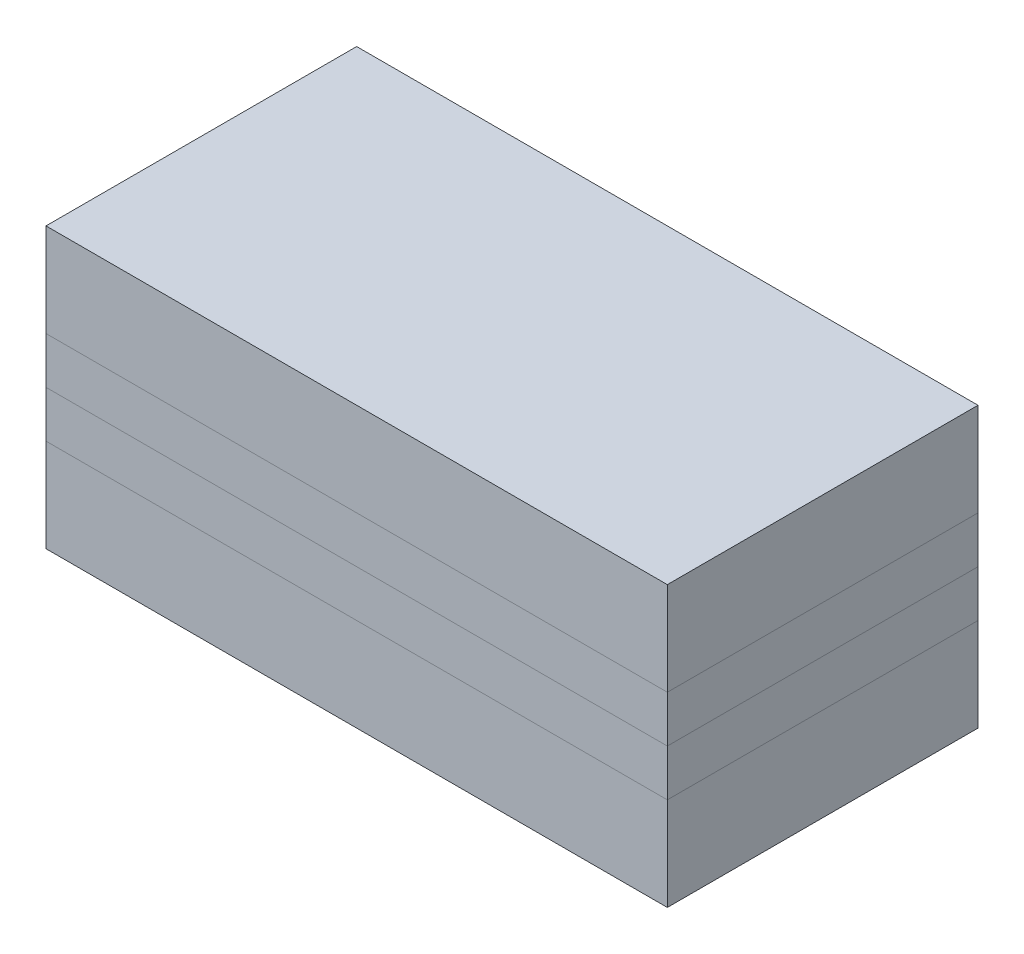
ISO-10303-21;
HEADER;
FILE_DESCRIPTION(('STEP AP214'),'2;1');
FILE_NAME('part.step','',(''),(''),'','','');
FILE_SCHEMA(('AUTOMOTIVE_DESIGN { 1 0 10303 214 1 1 1 1 }'));
ENDSEC;
DATA;
#1=APPLICATION_CONTEXT('core data for automotive mechanical design processes');
#2=APPLICATION_PROTOCOL_DEFINITION('international standard','automotive_design',2000,#1);
#3=PRODUCT_CONTEXT('',#1,'mechanical');
#4=PRODUCT('Part','Part','',(#3));
#5=PRODUCT_RELATED_PRODUCT_CATEGORY('part','',(#4));
#6=PRODUCT_DEFINITION_FORMATION('','',#4);
#7=PRODUCT_DEFINITION_CONTEXT('part definition',#1,'design');
#8=PRODUCT_DEFINITION('design','',#6,#7);
#9=PRODUCT_DEFINITION_SHAPE('','',#8);
#10=(LENGTH_UNIT() NAMED_UNIT(*) SI_UNIT(.MILLI.,.METRE.));
#11=(NAMED_UNIT(*) PLANE_ANGLE_UNIT() SI_UNIT($,.RADIAN.));
#12=(NAMED_UNIT(*) SI_UNIT($,.STERADIAN.) SOLID_ANGLE_UNIT());
#13=UNCERTAINTY_MEASURE_WITH_UNIT(LENGTH_MEASURE(1.E-05),#10,'distance_accuracy_value','');
#14=(GEOMETRIC_REPRESENTATION_CONTEXT(3) GLOBAL_UNCERTAINTY_ASSIGNED_CONTEXT((#13)) GLOBAL_UNIT_ASSIGNED_CONTEXT((#10,
#11,#12)) REPRESENTATION_CONTEXT('',''));
#15=CARTESIAN_POINT('',(0.,0.,0.));
#16=DIRECTION('',(0.,0.,1.));
#17=DIRECTION('',(1.,0.,0.));
#18=AXIS2_PLACEMENT_3D('',#15,#16,#17);
#19=CARTESIAN_POINT('',(-64.3133486456374,36.507986447248,1005.00000000001));
#20=DIRECTION('',(0.,-1.,0.));
#21=DIRECTION('',(0.,0.,-1.));
#22=AXIS2_PLACEMENT_3D('',#19,#20,#21);
#23=PLANE('',#22);
#24=DIRECTION('',(-1.,0.,0.));
#25=VECTOR('',#24,1.);
#26=CARTESIAN_POINT('',(-64.3133486456374,36.507986447248,995.000000000007));
#27=LINE('',#26,#25);
#28=CARTESIAN_POINT('',(-64.3133486456374,36.507986447248,995.000000000007));
#29=VERTEX_POINT('',#28);
#30=CARTESIAN_POINT('',(-84.3133486456373,36.507986447248,995.000000000007));
#31=VERTEX_POINT('',#30);
#32=EDGE_CURVE('P0_E80',#29,#31,#27,.T.);
#33=ORIENTED_EDGE('',*,*,#32,.T.);
#34=DIRECTION('',(0.,0.,-1.));
#35=VECTOR('',#34,1.);
#36=CARTESIAN_POINT('',(-84.3133486456373,36.507986447248,1005.00000000001));
#37=LINE('',#36,#35);
#38=CARTESIAN_POINT('',(-84.3133486456373,36.507986447248,1005.00000000001));
#39=VERTEX_POINT('',#38);
#40=EDGE_CURVE('P0_E11',#39,#31,#37,.T.);
#41=ORIENTED_EDGE('',*,*,#40,.F.);
#42=DIRECTION('',(-1.,0.,0.));
#43=VECTOR('',#42,1.);
#44=CARTESIAN_POINT('',(-64.3133486456374,36.507986447248,1005.00000000001));
#45=LINE('',#44,#43);
#46=CARTESIAN_POINT('',(-64.3133486456374,36.507986447248,1005.00000000001));
#47=VERTEX_POINT('',#46);
#48=EDGE_CURVE('P0_E68',#47,#39,#45,.T.);
#49=ORIENTED_EDGE('',*,*,#48,.F.);
#50=DIRECTION('',(0.,0.,-1.));
#51=VECTOR('',#50,1.);
#52=CARTESIAN_POINT('',(-64.3133486456374,36.507986447248,1005.00000000001));
#53=LINE('',#52,#51);
#54=EDGE_CURVE('P0_E76',#47,#29,#53,.T.);
#55=ORIENTED_EDGE('',*,*,#54,.T.);
#56=EDGE_LOOP('',(#33,#41,#49,#55));
#57=FACE_BOUND('',#56,.T.);
#58=ADVANCED_FACE('P0_F17',(#57),#23,.F.);
#59=CARTESIAN_POINT('',(-84.3133486456373,33.507986447248,1005.00000000001));
#60=DIRECTION('',(1.,0.,0.));
#61=DIRECTION('',(0.,0.,-1.));
#62=AXIS2_PLACEMENT_3D('',#59,#60,#61);
#63=PLANE('',#62);
#64=DIRECTION('',(0.,-1.,0.));
#65=VECTOR('',#64,1.);
#66=CARTESIAN_POINT('',(-84.3133486456373,33.507986447248,995.000000000007));
#67=LINE('',#66,#65);
#68=CARTESIAN_POINT('',(-84.3133486456373,33.507986447248,995.000000000007));
#69=VERTEX_POINT('',#68);
#70=EDGE_CURVE('P0_E72',#31,#69,#67,.T.);
#71=ORIENTED_EDGE('',*,*,#70,.T.);
#72=DIRECTION('',(0.,0.,-1.));
#73=VECTOR('',#72,1.);
#74=CARTESIAN_POINT('',(-84.3133486456373,33.507986447248,1005.00000000001));
#75=LINE('',#74,#73);
#76=CARTESIAN_POINT('',(-84.3133486456373,33.507986447248,1005.00000000001));
#77=VERTEX_POINT('',#76);
#78=EDGE_CURVE('P0_E25',#77,#69,#75,.T.);
#79=ORIENTED_EDGE('',*,*,#78,.F.);
#80=DIRECTION('',(0.,-1.,0.));
#81=VECTOR('',#80,1.);
#82=CARTESIAN_POINT('',(-84.3133486456373,33.507986447248,1005.00000000001));
#83=LINE('',#82,#81);
#84=EDGE_CURVE('P0_E63',#39,#77,#83,.T.);
#85=ORIENTED_EDGE('',*,*,#84,.F.);
#86=ORIENTED_EDGE('',*,*,#40,.T.);
#87=EDGE_LOOP('',(#71,#79,#85,#86));
#88=FACE_BOUND('',#87,.T.);
#89=ADVANCED_FACE('P0_F71',(#88),#63,.F.);
#90=CARTESIAN_POINT('',(-64.3133486456374,33.507986447248,1005.00000000001));
#91=DIRECTION('',(0.,1.,0.));
#92=DIRECTION('',(0.,0.,1.));
#93=AXIS2_PLACEMENT_3D('',#90,#91,#92);
#94=PLANE('',#93);
#95=DIRECTION('',(1.,0.,0.));
#96=VECTOR('',#95,1.);
#97=CARTESIAN_POINT('',(-64.3133486456374,33.507986447248,995.000000000007));
#98=LINE('',#97,#96);
#99=CARTESIAN_POINT('',(-64.3133486456374,33.507986447248,995.000000000007));
#100=VERTEX_POINT('',#99);
#101=EDGE_CURVE('P0_E50',#69,#100,#98,.T.);
#102=ORIENTED_EDGE('',*,*,#101,.T.);
#103=DIRECTION('',(0.,0.,-1.));
#104=VECTOR('',#103,1.);
#105=CARTESIAN_POINT('',(-64.3133486456374,33.507986447248,1005.00000000001));
#106=LINE('',#105,#104);
#107=CARTESIAN_POINT('',(-64.3133486456374,33.507986447248,1005.00000000001));
#108=VERTEX_POINT('',#107);
#109=EDGE_CURVE('P0_E73',#108,#100,#106,.T.);
#110=ORIENTED_EDGE('',*,*,#109,.F.);
#111=DIRECTION('',(1.,0.,0.));
#112=VECTOR('',#111,1.);
#113=CARTESIAN_POINT('',(-64.3133486456374,33.507986447248,1005.00000000001));
#114=LINE('',#113,#112);
#115=EDGE_CURVE('P0_E66',#77,#108,#114,.T.);
#116=ORIENTED_EDGE('',*,*,#115,.F.);
#117=ORIENTED_EDGE('',*,*,#78,.T.);
#118=EDGE_LOOP('',(#102,#110,#116,#117));
#119=FACE_BOUND('',#118,.T.);
#120=ADVANCED_FACE('P0_F74',(#119),#94,.F.);
#121=CARTESIAN_POINT('',(-64.3133486456374,33.507986447248,1005.00000000001));
#122=DIRECTION('',(-1.,0.,0.));
#123=DIRECTION('',(0.,0.,1.));
#124=AXIS2_PLACEMENT_3D('',#121,#122,#123);
#125=PLANE('',#124);
#126=DIRECTION('',(0.,1.,0.));
#127=VECTOR('',#126,1.);
#128=CARTESIAN_POINT('',(-64.3133486456374,33.507986447248,995.000000000007));
#129=LINE('',#128,#127);
#130=EDGE_CURVE('P0_E56',#100,#29,#129,.T.);
#131=ORIENTED_EDGE('',*,*,#130,.T.);
#132=ORIENTED_EDGE('',*,*,#54,.F.);
#133=DIRECTION('',(0.,1.,0.));
#134=VECTOR('',#133,1.);
#135=CARTESIAN_POINT('',(-64.3133486456374,33.507986447248,1005.00000000001));
#136=LINE('',#135,#134);
#137=EDGE_CURVE('P0_E33',#108,#47,#136,.T.);
#138=ORIENTED_EDGE('',*,*,#137,.F.);
#139=ORIENTED_EDGE('',*,*,#109,.T.);
#140=EDGE_LOOP('',(#131,#132,#138,#139));
#141=FACE_BOUND('',#140,.T.);
#142=ADVANCED_FACE('P0_F87',(#141),#125,.F.);
#143=CARTESIAN_POINT('',(-74.3133486456373,35.007986447248,1005.00000000001));
#144=DIRECTION('',(0.,0.,-1.));
#145=DIRECTION('',(-1.,0.,0.));
#146=AXIS2_PLACEMENT_3D('',#143,#144,#145);
#147=PLANE('',#146);
#148=ORIENTED_EDGE('',*,*,#48,.T.);
#149=ORIENTED_EDGE('',*,*,#84,.T.);
#150=ORIENTED_EDGE('',*,*,#115,.T.);
#151=ORIENTED_EDGE('',*,*,#137,.T.);
#152=EDGE_LOOP('',(#148,#149,#150,#151));
#153=FACE_BOUND('',#152,.T.);
#154=ADVANCED_FACE('P0_F64',(#153),#147,.F.);
#155=CARTESIAN_POINT('',(-74.3133486456373,35.007986447248,995.000000000007));
#156=DIRECTION('',(0.,0.,-1.));
#157=DIRECTION('',(-1.,0.,0.));
#158=AXIS2_PLACEMENT_3D('',#155,#156,#157);
#159=PLANE('',#158);
#160=ORIENTED_EDGE('',*,*,#32,.F.);
#161=ORIENTED_EDGE('',*,*,#130,.F.);
#162=ORIENTED_EDGE('',*,*,#101,.F.);
#163=ORIENTED_EDGE('',*,*,#70,.F.);
#164=EDGE_LOOP('',(#160,#161,#162,#163));
#165=FACE_BOUND('',#164,.T.);
#166=ADVANCED_FACE('P0_F90',(#165),#159,.T.);
#167=CLOSED_SHELL('',(#58,#89,#120,#142,#154,#166));
#168=MANIFOLD_SOLID_BREP('P0_B1',#167);
#169=CARTESIAN_POINT('',(-64.3133486456373,42.507986447248,1005.00000000001));
#170=DIRECTION('',(0.,-1.,0.));
#171=DIRECTION('',(0.,0.,-1.));
#172=AXIS2_PLACEMENT_3D('',#169,#170,#171);
#173=PLANE('',#172);
#174=DIRECTION('',(-1.,0.,0.));
#175=VECTOR('',#174,1.);
#176=CARTESIAN_POINT('',(-64.3133486456373,42.507986447248,995.000000000007));
#177=LINE('',#176,#175);
#178=CARTESIAN_POINT('',(-64.3133486456373,42.507986447248,995.000000000007));
#179=VERTEX_POINT('',#178);
#180=CARTESIAN_POINT('',(-84.3133486456373,42.507986447248,995.000000000007));
#181=VERTEX_POINT('',#180);
#182=EDGE_CURVE('P1_E86',#179,#181,#177,.T.);
#183=ORIENTED_EDGE('',*,*,#182,.T.);
#184=DIRECTION('',(0.,0.,-1.));
#185=VECTOR('',#184,1.);
#186=CARTESIAN_POINT('',(-84.3133486456373,42.507986447248,1005.00000000001));
#187=LINE('',#186,#185);
#188=CARTESIAN_POINT('',(-84.3133486456373,42.507986447248,1005.00000000001));
#189=VERTEX_POINT('',#188);
#190=EDGE_CURVE('P1_E11',#189,#181,#187,.T.);
#191=ORIENTED_EDGE('',*,*,#190,.F.);
#192=DIRECTION('',(-1.,0.,0.));
#193=VECTOR('',#192,1.);
#194=CARTESIAN_POINT('',(-64.3133486456373,42.507986447248,1005.00000000001));
#195=LINE('',#194,#193);
#196=CARTESIAN_POINT('',(-64.3133486456373,42.507986447248,1005.00000000001));
#197=VERTEX_POINT('',#196);
#198=EDGE_CURVE('P1_E69',#197,#189,#195,.T.);
#199=ORIENTED_EDGE('',*,*,#198,.F.);
#200=DIRECTION('',(0.,0.,-1.));
#201=VECTOR('',#200,1.);
#202=CARTESIAN_POINT('',(-64.3133486456373,42.507986447248,1005.00000000001));
#203=LINE('',#202,#201);
#204=EDGE_CURVE('P1_E82',#197,#179,#203,.T.);
#205=ORIENTED_EDGE('',*,*,#204,.T.);
#206=EDGE_LOOP('',(#183,#191,#199,#205));
#207=FACE_BOUND('',#206,.T.);
#208=ADVANCED_FACE('P1_F17',(#207),#173,.F.);
#209=CARTESIAN_POINT('',(-84.3133486456373,39.507986447248,1005.00000000001));
#210=DIRECTION('',(1.,0.,0.));
#211=DIRECTION('',(0.,0.,-1.));
#212=AXIS2_PLACEMENT_3D('',#209,#210,#211);
#213=PLANE('',#212);
#214=DIRECTION('',(0.,-1.,0.));
#215=VECTOR('',#214,1.);
#216=CARTESIAN_POINT('',(-84.3133486456373,39.507986447248,995.000000000007));
#217=LINE('',#216,#215);
#218=CARTESIAN_POINT('',(-84.3133486456373,39.507986447248,995.000000000007));
#219=VERTEX_POINT('',#218);
#220=EDGE_CURVE('P1_E74',#181,#219,#217,.T.);
#221=ORIENTED_EDGE('',*,*,#220,.T.);
#222=DIRECTION('',(0.,0.,-1.));
#223=VECTOR('',#222,1.);
#224=CARTESIAN_POINT('',(-84.3133486456373,39.507986447248,1005.00000000001));
#225=LINE('',#224,#223);
#226=CARTESIAN_POINT('',(-84.3133486456373,39.507986447248,1005.00000000001));
#227=VERTEX_POINT('',#226);
#228=EDGE_CURVE('P1_E26',#227,#219,#225,.T.);
#229=ORIENTED_EDGE('',*,*,#228,.F.);
#230=DIRECTION('',(0.,-1.,0.));
#231=VECTOR('',#230,1.);
#232=CARTESIAN_POINT('',(-84.3133486456373,39.507986447248,1005.00000000001));
#233=LINE('',#232,#231);
#234=EDGE_CURVE('P1_E64',#189,#227,#233,.T.);
#235=ORIENTED_EDGE('',*,*,#234,.F.);
#236=ORIENTED_EDGE('',*,*,#190,.T.);
#237=EDGE_LOOP('',(#221,#229,#235,#236));
#238=FACE_BOUND('',#237,.T.);
#239=ADVANCED_FACE('P1_F73',(#238),#213,.F.);
#240=CARTESIAN_POINT('',(-64.3133486456373,39.507986447248,1005.00000000001));
#241=DIRECTION('',(0.,1.,0.));
#242=DIRECTION('',(0.,0.,1.));
#243=AXIS2_PLACEMENT_3D('',#240,#241,#242);
#244=PLANE('',#243);
#245=DIRECTION('',(1.,0.,0.));
#246=VECTOR('',#245,1.);
#247=CARTESIAN_POINT('',(-64.3133486456373,39.507986447248,995.000000000007));
#248=LINE('',#247,#246);
#249=CARTESIAN_POINT('',(-64.3133486456373,39.507986447248,995.000000000007));
#250=VERTEX_POINT('',#249);
#251=EDGE_CURVE('P1_E51',#219,#250,#248,.T.);
#252=ORIENTED_EDGE('',*,*,#251,.T.);
#253=DIRECTION('',(0.,0.,-1.));
#254=VECTOR('',#253,1.);
#255=CARTESIAN_POINT('',(-64.3133486456373,39.507986447248,1005.00000000001));
#256=LINE('',#255,#254);
#257=CARTESIAN_POINT('',(-64.3133486456373,39.507986447248,1005.00000000001));
#258=VERTEX_POINT('',#257);
#259=EDGE_CURVE('P1_E76',#258,#250,#256,.T.);
#260=ORIENTED_EDGE('',*,*,#259,.F.);
#261=DIRECTION('',(1.,0.,0.));
#262=VECTOR('',#261,1.);
#263=CARTESIAN_POINT('',(-64.3133486456373,39.507986447248,1005.00000000001));
#264=LINE('',#263,#262);
#265=EDGE_CURVE('P1_E67',#227,#258,#264,.T.);
#266=ORIENTED_EDGE('',*,*,#265,.F.);
#267=ORIENTED_EDGE('',*,*,#228,.T.);
#268=EDGE_LOOP('',(#252,#260,#266,#267));
#269=FACE_BOUND('',#268,.T.);
#270=ADVANCED_FACE('P1_F77',(#269),#244,.F.);
#271=CARTESIAN_POINT('',(-64.3133486456373,39.507986447248,1005.00000000001));
#272=DIRECTION('',(-1.,0.,0.));
#273=DIRECTION('',(0.,0.,1.));
#274=AXIS2_PLACEMENT_3D('',#271,#272,#273);
#275=PLANE('',#274);
#276=DIRECTION('',(0.,1.,0.));
#277=VECTOR('',#276,1.);
#278=CARTESIAN_POINT('',(-64.3133486456373,39.507986447248,995.000000000007));
#279=LINE('',#278,#277);
#280=EDGE_CURVE('P1_E57',#250,#179,#279,.T.);
#281=ORIENTED_EDGE('',*,*,#280,.T.);
#282=ORIENTED_EDGE('',*,*,#204,.F.);
#283=DIRECTION('',(0.,1.,0.));
#284=VECTOR('',#283,1.);
#285=CARTESIAN_POINT('',(-64.3133486456373,39.507986447248,1005.00000000001));
#286=LINE('',#285,#284);
#287=EDGE_CURVE('P1_E34',#258,#197,#286,.T.);
#288=ORIENTED_EDGE('',*,*,#287,.F.);
#289=ORIENTED_EDGE('',*,*,#259,.T.);
#290=EDGE_LOOP('',(#281,#282,#288,#289));
#291=FACE_BOUND('',#290,.T.);
#292=ADVANCED_FACE('P1_F99',(#291),#275,.F.);
#293=CARTESIAN_POINT('',(-74.3133486456373,41.007986447248,1005.00000000001));
#294=DIRECTION('',(0.,0.,-1.));
#295=DIRECTION('',(-1.,0.,0.));
#296=AXIS2_PLACEMENT_3D('',#293,#294,#295);
#297=PLANE('',#296);
#298=ORIENTED_EDGE('',*,*,#198,.T.);
#299=ORIENTED_EDGE('',*,*,#234,.T.);
#300=ORIENTED_EDGE('',*,*,#265,.T.);
#301=ORIENTED_EDGE('',*,*,#287,.T.);
#302=EDGE_LOOP('',(#298,#299,#300,#301));
#303=FACE_BOUND('',#302,.T.);
#304=ADVANCED_FACE('P1_F65',(#303),#297,.F.);
#305=CARTESIAN_POINT('',(-74.3133486456373,41.007986447248,995.000000000007));
#306=DIRECTION('',(0.,0.,-1.));
#307=DIRECTION('',(-1.,0.,0.));
#308=AXIS2_PLACEMENT_3D('',#305,#306,#307);
#309=PLANE('',#308);
#310=ORIENTED_EDGE('',*,*,#182,.F.);
#311=ORIENTED_EDGE('',*,*,#280,.F.);
#312=ORIENTED_EDGE('',*,*,#251,.F.);
#313=ORIENTED_EDGE('',*,*,#220,.F.);
#314=EDGE_LOOP('',(#310,#311,#312,#313));
#315=FACE_BOUND('',#314,.T.);
#316=ADVANCED_FACE('P1_F102',(#315),#309,.T.);
#317=CLOSED_SHELL('',(#208,#239,#270,#292,#304,#316));
#318=MANIFOLD_SOLID_BREP('P1_B1',#317);
#319=CARTESIAN_POINT('',(-64.3133486456373,38.007986447248,1005.00000000001));
#320=DIRECTION('',(0.,-1.,0.));
#321=DIRECTION('',(0.,0.,-1.));
#322=AXIS2_PLACEMENT_3D('',#319,#320,#321);
#323=PLANE('',#322);
#324=DIRECTION('',(-1.,0.,0.));
#325=VECTOR('',#324,1.);
#326=CARTESIAN_POINT('',(-64.3133486456373,38.007986447248,995.000000000007));
#327=LINE('',#326,#325);
#328=CARTESIAN_POINT('',(-64.3133486456373,38.007986447248,995.000000000007));
#329=VERTEX_POINT('',#328);
#330=CARTESIAN_POINT('',(-84.3133486456373,38.007986447248,995.000000000007));
#331=VERTEX_POINT('',#330);
#332=EDGE_CURVE('P2_E80',#329,#331,#327,.T.);
#333=ORIENTED_EDGE('',*,*,#332,.T.);
#334=DIRECTION('',(0.,0.,-1.));
#335=VECTOR('',#334,1.);
#336=CARTESIAN_POINT('',(-84.3133486456373,38.007986447248,1005.00000000001));
#337=LINE('',#336,#335);
#338=CARTESIAN_POINT('',(-84.3133486456373,38.007986447248,1005.00000000001));
#339=VERTEX_POINT('',#338);
#340=EDGE_CURVE('P2_E11',#339,#331,#337,.T.);
#341=ORIENTED_EDGE('',*,*,#340,.F.);
#342=DIRECTION('',(-1.,0.,0.));
#343=VECTOR('',#342,1.);
#344=CARTESIAN_POINT('',(-64.3133486456373,38.007986447248,1005.00000000001));
#345=LINE('',#344,#343);
#346=CARTESIAN_POINT('',(-64.3133486456373,38.007986447248,1005.00000000001));
#347=VERTEX_POINT('',#346);
#348=EDGE_CURVE('P2_E68',#347,#339,#345,.T.);
#349=ORIENTED_EDGE('',*,*,#348,.F.);
#350=DIRECTION('',(0.,0.,-1.));
#351=VECTOR('',#350,1.);
#352=CARTESIAN_POINT('',(-64.3133486456373,38.007986447248,1005.00000000001));
#353=LINE('',#352,#351);
#354=EDGE_CURVE('P2_E76',#347,#329,#353,.T.);
#355=ORIENTED_EDGE('',*,*,#354,.T.);
#356=EDGE_LOOP('',(#333,#341,#349,#355));
#357=FACE_BOUND('',#356,.T.);
#358=ADVANCED_FACE('P2_F17',(#357),#323,.F.);
#359=CARTESIAN_POINT('',(-84.3133486456373,36.507986447248,1005.00000000001));
#360=DIRECTION('',(1.,0.,0.));
#361=DIRECTION('',(0.,0.,-1.));
#362=AXIS2_PLACEMENT_3D('',#359,#360,#361);
#363=PLANE('',#362);
#364=DIRECTION('',(0.,-1.,0.));
#365=VECTOR('',#364,1.);
#366=CARTESIAN_POINT('',(-84.3133486456373,36.507986447248,995.000000000007));
#367=LINE('',#366,#365);
#368=CARTESIAN_POINT('',(-84.3133486456373,36.507986447248,995.000000000007));
#369=VERTEX_POINT('',#368);
#370=EDGE_CURVE('P2_E72',#331,#369,#367,.T.);
#371=ORIENTED_EDGE('',*,*,#370,.T.);
#372=DIRECTION('',(0.,0.,-1.));
#373=VECTOR('',#372,1.);
#374=CARTESIAN_POINT('',(-84.3133486456373,36.507986447248,1005.00000000001));
#375=LINE('',#374,#373);
#376=CARTESIAN_POINT('',(-84.3133486456373,36.507986447248,1005.00000000001));
#377=VERTEX_POINT('',#376);
#378=EDGE_CURVE('P2_E25',#377,#369,#375,.T.);
#379=ORIENTED_EDGE('',*,*,#378,.F.);
#380=DIRECTION('',(0.,-1.,0.));
#381=VECTOR('',#380,1.);
#382=CARTESIAN_POINT('',(-84.3133486456373,36.507986447248,1005.00000000001));
#383=LINE('',#382,#381);
#384=EDGE_CURVE('P2_E63',#339,#377,#383,.T.);
#385=ORIENTED_EDGE('',*,*,#384,.F.);
#386=ORIENTED_EDGE('',*,*,#340,.T.);
#387=EDGE_LOOP('',(#371,#379,#385,#386));
#388=FACE_BOUND('',#387,.T.);
#389=ADVANCED_FACE('P2_F71',(#388),#363,.F.);
#390=CARTESIAN_POINT('',(-64.3133486456373,36.507986447248,1005.00000000001));
#391=DIRECTION('',(0.,1.,0.));
#392=DIRECTION('',(0.,0.,1.));
#393=AXIS2_PLACEMENT_3D('',#390,#391,#392);
#394=PLANE('',#393);
#395=DIRECTION('',(1.,0.,0.));
#396=VECTOR('',#395,1.);
#397=CARTESIAN_POINT('',(-64.3133486456373,36.507986447248,995.000000000007));
#398=LINE('',#397,#396);
#399=CARTESIAN_POINT('',(-64.3133486456373,36.507986447248,995.000000000007));
#400=VERTEX_POINT('',#399);
#401=EDGE_CURVE('P2_E50',#369,#400,#398,.T.);
#402=ORIENTED_EDGE('',*,*,#401,.T.);
#403=DIRECTION('',(0.,0.,-1.));
#404=VECTOR('',#403,1.);
#405=CARTESIAN_POINT('',(-64.3133486456373,36.507986447248,1005.00000000001));
#406=LINE('',#405,#404);
#407=CARTESIAN_POINT('',(-64.3133486456373,36.507986447248,1005.00000000001));
#408=VERTEX_POINT('',#407);
#409=EDGE_CURVE('P2_E73',#408,#400,#406,.T.);
#410=ORIENTED_EDGE('',*,*,#409,.F.);
#411=DIRECTION('',(1.,0.,0.));
#412=VECTOR('',#411,1.);
#413=CARTESIAN_POINT('',(-64.3133486456373,36.507986447248,1005.00000000001));
#414=LINE('',#413,#412);
#415=EDGE_CURVE('P2_E66',#377,#408,#414,.T.);
#416=ORIENTED_EDGE('',*,*,#415,.F.);
#417=ORIENTED_EDGE('',*,*,#378,.T.);
#418=EDGE_LOOP('',(#402,#410,#416,#417));
#419=FACE_BOUND('',#418,.T.);
#420=ADVANCED_FACE('P2_F74',(#419),#394,.F.);
#421=CARTESIAN_POINT('',(-64.3133486456373,36.507986447248,1005.00000000001));
#422=DIRECTION('',(-1.,0.,0.));
#423=DIRECTION('',(0.,0.,1.));
#424=AXIS2_PLACEMENT_3D('',#421,#422,#423);
#425=PLANE('',#424);
#426=DIRECTION('',(0.,1.,0.));
#427=VECTOR('',#426,1.);
#428=CARTESIAN_POINT('',(-64.3133486456373,36.507986447248,995.000000000007));
#429=LINE('',#428,#427);
#430=EDGE_CURVE('P2_E56',#400,#329,#429,.T.);
#431=ORIENTED_EDGE('',*,*,#430,.T.);
#432=ORIENTED_EDGE('',*,*,#354,.F.);
#433=DIRECTION('',(0.,1.,0.));
#434=VECTOR('',#433,1.);
#435=CARTESIAN_POINT('',(-64.3133486456373,36.507986447248,1005.00000000001));
#436=LINE('',#435,#434);
#437=EDGE_CURVE('P2_E33',#408,#347,#436,.T.);
#438=ORIENTED_EDGE('',*,*,#437,.F.);
#439=ORIENTED_EDGE('',*,*,#409,.T.);
#440=EDGE_LOOP('',(#431,#432,#438,#439));
#441=FACE_BOUND('',#440,.T.);
#442=ADVANCED_FACE('P2_F87',(#441),#425,.F.);
#443=CARTESIAN_POINT('',(-74.3133486456373,37.257986447248,1005.00000000001));
#444=DIRECTION('',(0.,0.,-1.));
#445=DIRECTION('',(-1.,0.,0.));
#446=AXIS2_PLACEMENT_3D('',#443,#444,#445);
#447=PLANE('',#446);
#448=ORIENTED_EDGE('',*,*,#348,.T.);
#449=ORIENTED_EDGE('',*,*,#384,.T.);
#450=ORIENTED_EDGE('',*,*,#415,.T.);
#451=ORIENTED_EDGE('',*,*,#437,.T.);
#452=EDGE_LOOP('',(#448,#449,#450,#451));
#453=FACE_BOUND('',#452,.T.);
#454=ADVANCED_FACE('P2_F64',(#453),#447,.F.);
#455=CARTESIAN_POINT('',(-74.3133486456373,37.257986447248,995.000000000007));
#456=DIRECTION('',(0.,0.,-1.));
#457=DIRECTION('',(-1.,0.,0.));
#458=AXIS2_PLACEMENT_3D('',#455,#456,#457);
#459=PLANE('',#458);
#460=ORIENTED_EDGE('',*,*,#332,.F.);
#461=ORIENTED_EDGE('',*,*,#430,.F.);
#462=ORIENTED_EDGE('',*,*,#401,.F.);
#463=ORIENTED_EDGE('',*,*,#370,.F.);
#464=EDGE_LOOP('',(#460,#461,#462,#463));
#465=FACE_BOUND('',#464,.T.);
#466=ADVANCED_FACE('P2_F90',(#465),#459,.T.);
#467=CLOSED_SHELL('',(#358,#389,#420,#442,#454,#466));
#468=MANIFOLD_SOLID_BREP('P2_B1',#467);
#469=CARTESIAN_POINT('',(-64.3133486456373,39.507986447248,1005.00000000001));
#470=DIRECTION('',(0.,-1.,0.));
#471=DIRECTION('',(0.,0.,-1.));
#472=AXIS2_PLACEMENT_3D('',#469,#470,#471);
#473=PLANE('',#472);
#474=DIRECTION('',(-1.,0.,0.));
#475=VECTOR('',#474,1.);
#476=CARTESIAN_POINT('',(-64.3133486456373,39.507986447248,995.000000000007));
#477=LINE('',#476,#475);
#478=CARTESIAN_POINT('',(-64.3133486456373,39.507986447248,995.000000000007));
#479=VERTEX_POINT('',#478);
#480=CARTESIAN_POINT('',(-84.3133486456373,39.507986447248,995.000000000007));
#481=VERTEX_POINT('',#480);
#482=EDGE_CURVE('P3_E79',#479,#481,#477,.T.);
#483=ORIENTED_EDGE('',*,*,#482,.T.);
#484=DIRECTION('',(0.,0.,-1.));
#485=VECTOR('',#484,1.);
#486=CARTESIAN_POINT('',(-84.3133486456373,39.507986447248,1005.00000000001));
#487=LINE('',#486,#485);
#488=CARTESIAN_POINT('',(-84.3133486456373,39.507986447248,1005.00000000001));
#489=VERTEX_POINT('',#488);
#490=EDGE_CURVE('P3_E10',#489,#481,#487,.T.);
#491=ORIENTED_EDGE('',*,*,#490,.F.);
#492=DIRECTION('',(-1.,0.,0.));
#493=VECTOR('',#492,1.);
#494=CARTESIAN_POINT('',(-64.3133486456373,39.507986447248,1005.00000000001));
#495=LINE('',#494,#493);
#496=CARTESIAN_POINT('',(-64.3133486456373,39.507986447248,1005.00000000001));
#497=VERTEX_POINT('',#496);
#498=EDGE_CURVE('P3_E67',#497,#489,#495,.T.);
#499=ORIENTED_EDGE('',*,*,#498,.F.);
#500=DIRECTION('',(0.,0.,-1.));
#501=VECTOR('',#500,1.);
#502=CARTESIAN_POINT('',(-64.3133486456373,39.507986447248,1005.00000000001));
#503=LINE('',#502,#501);
#504=EDGE_CURVE('P3_E75',#497,#479,#503,.T.);
#505=ORIENTED_EDGE('',*,*,#504,.T.);
#506=EDGE_LOOP('',(#483,#491,#499,#505));
#507=FACE_BOUND('',#506,.T.);
#508=ADVANCED_FACE('P3_F16',(#507),#473,.F.);
#509=CARTESIAN_POINT('',(-84.3133486456373,38.007986447248,1005.00000000001));
#510=DIRECTION('',(1.,0.,0.));
#511=DIRECTION('',(0.,0.,-1.));
#512=AXIS2_PLACEMENT_3D('',#509,#510,#511);
#513=PLANE('',#512);
#514=DIRECTION('',(0.,-1.,0.));
#515=VECTOR('',#514,1.);
#516=CARTESIAN_POINT('',(-84.3133486456373,38.007986447248,995.000000000007));
#517=LINE('',#516,#515);
#518=CARTESIAN_POINT('',(-84.3133486456373,38.007986447248,995.000000000007));
#519=VERTEX_POINT('',#518);
#520=EDGE_CURVE('P3_E71',#481,#519,#517,.T.);
#521=ORIENTED_EDGE('',*,*,#520,.T.);
#522=DIRECTION('',(0.,0.,-1.));
#523=VECTOR('',#522,1.);
#524=CARTESIAN_POINT('',(-84.3133486456373,38.007986447248,1005.00000000001));
#525=LINE('',#524,#523);
#526=CARTESIAN_POINT('',(-84.3133486456373,38.007986447248,1005.00000000001));
#527=VERTEX_POINT('',#526);
#528=EDGE_CURVE('P3_E24',#527,#519,#525,.T.);
#529=ORIENTED_EDGE('',*,*,#528,.F.);
#530=DIRECTION('',(0.,-1.,0.));
#531=VECTOR('',#530,1.);
#532=CARTESIAN_POINT('',(-84.3133486456373,38.007986447248,1005.00000000001));
#533=LINE('',#532,#531);
#534=EDGE_CURVE('P3_E62',#489,#527,#533,.T.);
#535=ORIENTED_EDGE('',*,*,#534,.F.);
#536=ORIENTED_EDGE('',*,*,#490,.T.);
#537=EDGE_LOOP('',(#521,#529,#535,#536));
#538=FACE_BOUND('',#537,.T.);
#539=ADVANCED_FACE('P3_F70',(#538),#513,.F.);
#540=CARTESIAN_POINT('',(-64.3133486456373,38.007986447248,1005.00000000001));
#541=DIRECTION('',(0.,1.,0.));
#542=DIRECTION('',(0.,0.,1.));
#543=AXIS2_PLACEMENT_3D('',#540,#541,#542);
#544=PLANE('',#543);
#545=DIRECTION('',(1.,0.,0.));
#546=VECTOR('',#545,1.);
#547=CARTESIAN_POINT('',(-64.3133486456373,38.007986447248,995.000000000007));
#548=LINE('',#547,#546);
#549=CARTESIAN_POINT('',(-64.3133486456373,38.007986447248,995.000000000007));
#550=VERTEX_POINT('',#549);
#551=EDGE_CURVE('P3_E49',#519,#550,#548,.T.);
#552=ORIENTED_EDGE('',*,*,#551,.T.);
#553=DIRECTION('',(0.,0.,-1.));
#554=VECTOR('',#553,1.);
#555=CARTESIAN_POINT('',(-64.3133486456373,38.007986447248,1005.00000000001));
#556=LINE('',#555,#554);
#557=CARTESIAN_POINT('',(-64.3133486456373,38.007986447248,1005.00000000001));
#558=VERTEX_POINT('',#557);
#559=EDGE_CURVE('P3_E72',#558,#550,#556,.T.);
#560=ORIENTED_EDGE('',*,*,#559,.F.);
#561=DIRECTION('',(1.,0.,0.));
#562=VECTOR('',#561,1.);
#563=CARTESIAN_POINT('',(-64.3133486456373,38.007986447248,1005.00000000001));
#564=LINE('',#563,#562);
#565=EDGE_CURVE('P3_E65',#527,#558,#564,.T.);
#566=ORIENTED_EDGE('',*,*,#565,.F.);
#567=ORIENTED_EDGE('',*,*,#528,.T.);
#568=EDGE_LOOP('',(#552,#560,#566,#567));
#569=FACE_BOUND('',#568,.T.);
#570=ADVANCED_FACE('P3_F73',(#569),#544,.F.);
#571=CARTESIAN_POINT('',(-64.3133486456373,38.007986447248,1005.00000000001));
#572=DIRECTION('',(-1.,0.,0.));
#573=DIRECTION('',(0.,0.,1.));
#574=AXIS2_PLACEMENT_3D('',#571,#572,#573);
#575=PLANE('',#574);
#576=DIRECTION('',(0.,1.,0.));
#577=VECTOR('',#576,1.);
#578=CARTESIAN_POINT('',(-64.3133486456373,38.007986447248,995.000000000007));
#579=LINE('',#578,#577);
#580=EDGE_CURVE('P3_E55',#550,#479,#579,.T.);
#581=ORIENTED_EDGE('',*,*,#580,.T.);
#582=ORIENTED_EDGE('',*,*,#504,.F.);
#583=DIRECTION('',(0.,1.,0.));
#584=VECTOR('',#583,1.);
#585=CARTESIAN_POINT('',(-64.3133486456373,38.007986447248,1005.00000000001));
#586=LINE('',#585,#584);
#587=EDGE_CURVE('P3_E32',#558,#497,#586,.T.);
#588=ORIENTED_EDGE('',*,*,#587,.F.);
#589=ORIENTED_EDGE('',*,*,#559,.T.);
#590=EDGE_LOOP('',(#581,#582,#588,#589));
#591=FACE_BOUND('',#590,.T.);
#592=ADVANCED_FACE('P3_F86',(#591),#575,.F.);
#593=CARTESIAN_POINT('',(-74.3133486456373,38.757986447248,1005.00000000001));
#594=DIRECTION('',(0.,0.,-1.));
#595=DIRECTION('',(-1.,0.,0.));
#596=AXIS2_PLACEMENT_3D('',#593,#594,#595);
#597=PLANE('',#596);
#598=ORIENTED_EDGE('',*,*,#498,.T.);
#599=ORIENTED_EDGE('',*,*,#534,.T.);
#600=ORIENTED_EDGE('',*,*,#565,.T.);
#601=ORIENTED_EDGE('',*,*,#587,.T.);
#602=EDGE_LOOP('',(#598,#599,#600,#601));
#603=FACE_BOUND('',#602,.T.);
#604=ADVANCED_FACE('P3_F63',(#603),#597,.F.);
#605=CARTESIAN_POINT('',(-74.3133486456373,38.757986447248,995.000000000007));
#606=DIRECTION('',(0.,0.,-1.));
#607=DIRECTION('',(-1.,0.,0.));
#608=AXIS2_PLACEMENT_3D('',#605,#606,#607);
#609=PLANE('',#608);
#610=ORIENTED_EDGE('',*,*,#482,.F.);
#611=ORIENTED_EDGE('',*,*,#580,.F.);
#612=ORIENTED_EDGE('',*,*,#551,.F.);
#613=ORIENTED_EDGE('',*,*,#520,.F.);
#614=EDGE_LOOP('',(#610,#611,#612,#613));
#615=FACE_BOUND('',#614,.T.);
#616=ADVANCED_FACE('P3_F89',(#615),#609,.T.);
#617=CLOSED_SHELL('',(#508,#539,#570,#592,#604,#616));
#618=MANIFOLD_SOLID_BREP('P3_B1',#617);
#619=ADVANCED_BREP_SHAPE_REPRESENTATION('',(#18,#168,#318,#468,#618),#14);
#620=SHAPE_DEFINITION_REPRESENTATION(#9,#619);
ENDSEC;
END-ISO-10303-21;
